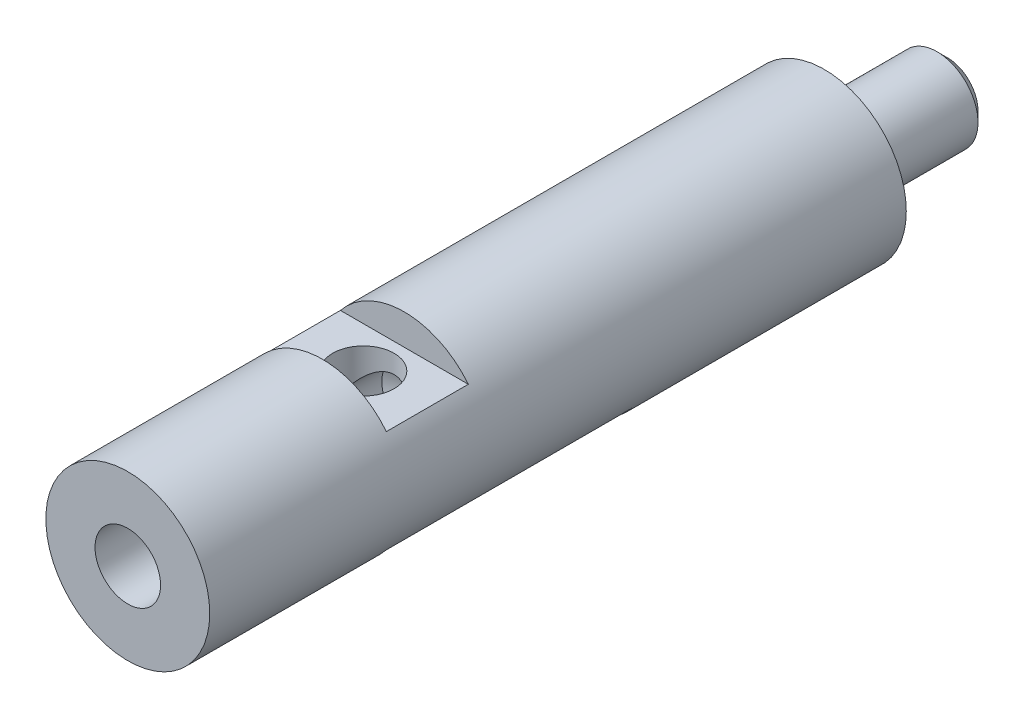
ISO-10303-21;
HEADER;
FILE_DESCRIPTION(('STEP AP214'),'2;1');
FILE_NAME('part.step','',(''),(''),'','','');
FILE_SCHEMA(('AUTOMOTIVE_DESIGN { 1 0 10303 214 1 1 1 1 }'));
ENDSEC;
DATA;
#1=APPLICATION_CONTEXT('core data for automotive mechanical design processes');
#2=APPLICATION_PROTOCOL_DEFINITION('international standard','automotive_design',2000,#1);
#3=PRODUCT_CONTEXT('',#1,'mechanical');
#4=PRODUCT('Part','Part','',(#3));
#5=PRODUCT_RELATED_PRODUCT_CATEGORY('part','',(#4));
#6=PRODUCT_DEFINITION_FORMATION('','',#4);
#7=PRODUCT_DEFINITION_CONTEXT('part definition',#1,'design');
#8=PRODUCT_DEFINITION('design','',#6,#7);
#9=PRODUCT_DEFINITION_SHAPE('','',#8);
#10=(LENGTH_UNIT() NAMED_UNIT(*) SI_UNIT(.MILLI.,.METRE.));
#11=(NAMED_UNIT(*) PLANE_ANGLE_UNIT() SI_UNIT($,.RADIAN.));
#12=(NAMED_UNIT(*) SI_UNIT($,.STERADIAN.) SOLID_ANGLE_UNIT());
#13=UNCERTAINTY_MEASURE_WITH_UNIT(LENGTH_MEASURE(1.E-05),#10,'distance_accuracy_value','');
#14=(GEOMETRIC_REPRESENTATION_CONTEXT(3) GLOBAL_UNCERTAINTY_ASSIGNED_CONTEXT((#13)) GLOBAL_UNIT_ASSIGNED_CONTEXT((#10,
#11,#12)) REPRESENTATION_CONTEXT('',''));
#15=CARTESIAN_POINT('',(0.,0.,0.));
#16=DIRECTION('',(0.,0.,1.));
#17=DIRECTION('',(1.,0.,0.));
#18=AXIS2_PLACEMENT_3D('',#15,#16,#17);
#19=CARTESIAN_POINT('',(-6.00000133751827,3.70264042682365,-4.81401753038767));
#20=DIRECTION('',(0.,-1.,0.));
#21=DIRECTION('',(0.,0.,-1.));
#22=AXIS2_PLACEMENT_3D('',#19,#20,#21);
#23=PLANE('',#22);
#24=DIRECTION('',(0.,0.,1.));
#25=VECTOR('',#24,1.);
#26=CARTESIAN_POINT('',(4.68374716128053,3.70264042682365,-41.5640175303877));
#27=LINE('',#26,#25);
#28=CARTESIAN_POINT('',(4.68374716128053,3.70264042682365,-4.81401753038767));
#29=VERTEX_POINT('',#28);
#30=CARTESIAN_POINT('',(4.68374716128053,3.70264042682365,-10.8140175303877));
#31=VERTEX_POINT('',#30);
#32=EDGE_CURVE('E83',#29,#31,#27,.F.);
#33=ORIENTED_EDGE('',*,*,#32,.T.);
#34=DIRECTION('',(1.,0.,0.));
#35=VECTOR('',#34,1.);
#36=CARTESIAN_POINT('',(-6.00000133751827,3.70264042682365,-10.8140175303877));
#37=LINE('',#36,#35);
#38=CARTESIAN_POINT('',(-4.68374983631707,3.70264042682365,-10.8140175303877));
#39=VERTEX_POINT('',#38);
#40=EDGE_CURVE('E52',#39,#31,#37,.T.);
#41=ORIENTED_EDGE('',*,*,#40,.F.);
#42=DIRECTION('',(0.,0.,1.));
#43=VECTOR('',#42,1.);
#44=CARTESIAN_POINT('',(-4.68374983631707,3.70264042682365,-41.5640175303877));
#45=LINE('',#44,#43);
#46=CARTESIAN_POINT('',(-4.68374983631707,3.70264042682365,-4.81401753038767));
#47=VERTEX_POINT('',#46);
#48=EDGE_CURVE('E84',#39,#47,#45,.T.);
#49=ORIENTED_EDGE('',*,*,#48,.T.);
#50=DIRECTION('',(1.,0.,0.));
#51=VECTOR('',#50,1.);
#52=CARTESIAN_POINT('',(-6.00000133751827,3.70264042682365,-4.81401753038767));
#53=LINE('',#52,#51);
#54=EDGE_CURVE('E91',#47,#29,#53,.T.);
#55=ORIENTED_EDGE('',*,*,#54,.T.);
#56=EDGE_LOOP('',(#33,#41,#49,#55));
#57=FACE_BOUND('',#56,.T.);
#58=CARTESIAN_POINT('',(-1.33751827095262E-06,3.70264042682365,-7.81401753038767));
#59=DIRECTION('',(0.,1.,0.));
#60=DIRECTION('',(0.,0.,1.));
#61=AXIS2_PLACEMENT_3D('',#58,#59,#60);
#62=CIRCLE('',#61,2.24999999999998);
#63=CARTESIAN_POINT('',(-1.33751827095262E-06,3.70264042682365,-5.56401753038769));
#64=VERTEX_POINT('',#63);
#65=EDGE_CURVE('E293',#64,#64,#62,.T.);
#66=ORIENTED_EDGE('',*,*,#65,.F.);
#67=EDGE_LOOP('',(#66));
#68=FACE_BOUND('',#67,.T.);
#69=ADVANCED_FACE('F37',(#57,#68),#23,.F.);
#70=CARTESIAN_POINT('',(-1.33751827062736E-06,-0.0473595731763541,-41.5640175303877));
#71=DIRECTION('',(0.,0.,1.));
#72=DIRECTION('',(1.,0.,0.));
#73=AXIS2_PLACEMENT_3D('',#70,#71,#72);
#74=CYLINDRICAL_SURFACE('',#73,6.);
#75=CARTESIAN_POINT('',(-1.33751827062736E-06,-0.0473595731763541,-22.8140175303877));
#76=DIRECTION('',(0.,0.,-1.));
#77=DIRECTION('',(-1.,0.,0.));
#78=AXIS2_PLACEMENT_3D('',#75,#76,#77);
#79=CIRCLE('',#78,6.);
#80=CARTESIAN_POINT('',(-4.68374983631707,-3.79735957317635,-22.8140175303877));
#81=VERTEX_POINT('',#80);
#82=CARTESIAN_POINT('',(4.68374716128053,-3.79735957317635,-22.8140175303877));
#83=VERTEX_POINT('',#82);
#84=EDGE_CURVE('E92',#81,#83,#79,.F.);
#85=ORIENTED_EDGE('',*,*,#84,.F.);
#86=DIRECTION('',(0.,0.,1.));
#87=VECTOR('',#86,1.);
#88=CARTESIAN_POINT('',(-4.68374983631707,-3.79735957317635,-41.5640175303877));
#89=LINE('',#88,#87);
#90=CARTESIAN_POINT('',(-4.68374983631707,-3.79735957317635,-4.81401753038767));
#91=VERTEX_POINT('',#90);
#92=EDGE_CURVE('E11',#91,#81,#89,.F.);
#93=ORIENTED_EDGE('',*,*,#92,.F.);
#94=CARTESIAN_POINT('',(-1.33751827062736E-06,-0.0473595731763541,-4.81401753038767));
#95=DIRECTION('',(0.,0.,1.));
#96=DIRECTION('',(1.,0.,0.));
#97=AXIS2_PLACEMENT_3D('',#94,#95,#96);
#98=CIRCLE('',#97,6.);
#99=CARTESIAN_POINT('',(4.68374716128053,-3.79735957317635,-4.81401753038767));
#100=VERTEX_POINT('',#99);
#101=EDGE_CURVE('E45',#100,#91,#98,.F.);
#102=ORIENTED_EDGE('',*,*,#101,.F.);
#103=DIRECTION('',(0.,0.,1.));
#104=VECTOR('',#103,1.);
#105=CARTESIAN_POINT('',(4.68374716128053,-3.79735957317635,-41.5640175303877));
#106=LINE('',#105,#104);
#107=EDGE_CURVE('E128',#83,#100,#106,.T.);
#108=ORIENTED_EDGE('',*,*,#107,.F.);
#109=EDGE_LOOP('',(#85,#93,#102,#108));
#110=FACE_BOUND('',#109,.T.);
#111=ORIENTED_EDGE('',*,*,#32,.F.);
#112=CARTESIAN_POINT('',(-1.33751827062736E-06,-0.0473595731763541,-4.81401753038766));
#113=DIRECTION('',(0.,0.,1.));
#114=DIRECTION('',(0.,-1.,0.));
#115=AXIS2_PLACEMENT_3D('',#112,#113,#114);
#116=CIRCLE('',#115,6.);
#117=EDGE_CURVE('E86',#47,#29,#116,.F.);
#118=ORIENTED_EDGE('',*,*,#117,.F.);
#119=ORIENTED_EDGE('',*,*,#48,.F.);
#120=CARTESIAN_POINT('',(-1.33751827062736E-06,-0.0473595731763541,-10.8140175303877));
#121=DIRECTION('',(0.,0.,-1.));
#122=DIRECTION('',(-1.,0.,0.));
#123=AXIS2_PLACEMENT_3D('',#120,#121,#122);
#124=CIRCLE('',#123,6.);
#125=EDGE_CURVE('E79',#31,#39,#124,.F.);
#126=ORIENTED_EDGE('',*,*,#125,.F.);
#127=EDGE_LOOP('',(#111,#118,#119,#126));
#128=FACE_BOUND('',#127,.T.);
#129=CARTESIAN_POINT('',(-1.33751827062736E-06,-0.0473595731763541,-41.5640175303877));
#130=DIRECTION('',(0.,0.,1.));
#131=DIRECTION('',(1.,0.,0.));
#132=AXIS2_PLACEMENT_3D('',#129,#130,#131);
#133=CIRCLE('',#132,6.);
#134=CARTESIAN_POINT('',(5.99999866248173,-0.0473595731763541,-41.5640175303877));
#135=VERTEX_POINT('',#134);
#136=EDGE_CURVE('E115',#135,#135,#133,.T.);
#137=ORIENTED_EDGE('',*,*,#136,.T.);
#138=EDGE_LOOP('',(#137));
#139=FACE_BOUND('',#138,.T.);
#140=CARTESIAN_POINT('',(-1.33751827062736E-06,-0.0473595731763541,9.43598246961233));
#141=DIRECTION('',(0.,0.,1.));
#142=DIRECTION('',(1.,0.,0.));
#143=AXIS2_PLACEMENT_3D('',#140,#141,#142);
#144=CIRCLE('',#143,6.);
#145=CARTESIAN_POINT('',(5.99999866248173,-0.0473595731763541,9.43598246961233));
#146=VERTEX_POINT('',#145);
#147=EDGE_CURVE('E110',#146,#146,#144,.T.);
#148=ORIENTED_EDGE('',*,*,#147,.F.);
#149=EDGE_LOOP('',(#148));
#150=FACE_BOUND('',#149,.T.);
#151=ADVANCED_FACE('F80',(#110,#128,#139,#150),#74,.T.);
#152=CARTESIAN_POINT('',(-1.33751827062736E-06,-0.0473595731763541,-41.5640175303877));
#153=DIRECTION('',(0.,0.,1.));
#154=DIRECTION('',(1.,0.,0.));
#155=AXIS2_PLACEMENT_3D('',#152,#153,#154);
#156=PLANE('',#155);
#157=CARTESIAN_POINT('',(-1.33751827062736E-06,-0.0473595731763541,-41.5640175303877));
#158=DIRECTION('',(0.,0.,-1.));
#159=DIRECTION('',(-1.,0.,0.));
#160=AXIS2_PLACEMENT_3D('',#157,#158,#159);
#161=CIRCLE('',#160,3.);
#162=CARTESIAN_POINT('',(-3.00000133751827,-0.0473595731763541,-41.5640175303877));
#163=VERTEX_POINT('',#162);
#164=EDGE_CURVE('E111',#163,#163,#161,.T.);
#165=ORIENTED_EDGE('',*,*,#164,.F.);
#166=EDGE_LOOP('',(#165));
#167=FACE_BOUND('',#166,.T.);
#168=ORIENTED_EDGE('',*,*,#136,.F.);
#169=EDGE_LOOP('',(#168));
#170=FACE_BOUND('',#169,.T.);
#171=ADVANCED_FACE('F158',(#167,#170),#156,.F.);
#172=CARTESIAN_POINT('',(-1.33751827062736E-06,-0.0473595731763541,9.43598246961233));
#173=DIRECTION('',(0.,0.,1.));
#174=DIRECTION('',(1.,0.,0.));
#175=AXIS2_PLACEMENT_3D('',#172,#173,#174);
#176=PLANE('',#175);
#177=CARTESIAN_POINT('',(-1.33751827062736E-06,-0.0473595731763541,9.43598246961233));
#178=DIRECTION('',(0.,0.,1.));
#179=DIRECTION('',(1.,0.,0.));
#180=AXIS2_PLACEMENT_3D('',#177,#178,#179);
#181=CIRCLE('',#180,2.39999999999998);
#182=CARTESIAN_POINT('',(2.39999866248171,-0.0473595731763541,9.43598246961233));
#183=VERTEX_POINT('',#182);
#184=EDGE_CURVE('E104',#183,#183,#181,.T.);
#185=ORIENTED_EDGE('',*,*,#184,.F.);
#186=EDGE_LOOP('',(#185));
#187=FACE_BOUND('',#186,.T.);
#188=ORIENTED_EDGE('',*,*,#147,.T.);
#189=EDGE_LOOP('',(#188));
#190=FACE_BOUND('',#189,.T.);
#191=ADVANCED_FACE('F179',(#187,#190),#176,.T.);
#192=CARTESIAN_POINT('',(-1.33751827062736E-06,-0.0473595731763541,-50.5640175303877));
#193=DIRECTION('',(0.,0.,1.));
#194=DIRECTION('',(1.,0.,0.));
#195=AXIS2_PLACEMENT_3D('',#192,#193,#194);
#196=CYLINDRICAL_SURFACE('',#195,3.);
#197=CARTESIAN_POINT('',(-1.33751827062736E-06,-0.0473595731763541,-49.8140175303877));
#198=DIRECTION('',(0.,0.,-1.));
#199=DIRECTION('',(-1.,0.,0.));
#200=AXIS2_PLACEMENT_3D('',#197,#198,#199);
#201=CIRCLE('',#200,3.);
#202=CARTESIAN_POINT('',(-3.00000133751827,-0.0473595731763541,-49.8140175303877));
#203=VERTEX_POINT('',#202);
#204=EDGE_CURVE('E122',#203,#203,#201,.F.);
#205=ORIENTED_EDGE('',*,*,#204,.T.);
#206=EDGE_LOOP('',(#205));
#207=FACE_BOUND('',#206,.T.);
#208=ORIENTED_EDGE('',*,*,#164,.T.);
#209=EDGE_LOOP('',(#208));
#210=FACE_BOUND('',#209,.T.);
#211=ADVANCED_FACE('F175',(#207,#210),#196,.T.);
#212=CARTESIAN_POINT('',(-1.33751827062736E-06,-0.0473595731763541,-50.5640175303877));
#213=DIRECTION('',(0.,0.,-1.));
#214=DIRECTION('',(-1.,0.,0.));
#215=AXIS2_PLACEMENT_3D('',#212,#213,#214);
#216=PLANE('',#215);
#217=CARTESIAN_POINT('',(-1.33751827062736E-06,-0.0473595731763541,-50.5640175303877));
#218=DIRECTION('',(0.,0.,-1.));
#219=DIRECTION('',(-1.,0.,0.));
#220=AXIS2_PLACEMENT_3D('',#217,#218,#219);
#221=CIRCLE('',#220,2.24999999999999);
#222=CARTESIAN_POINT('',(-2.25000133751826,-0.0473595731763541,-50.5640175303877));
#223=VERTEX_POINT('',#222);
#224=EDGE_CURVE('E114',#223,#223,#221,.T.);
#225=ORIENTED_EDGE('',*,*,#224,.T.);
#226=EDGE_LOOP('',(#225));
#227=FACE_BOUND('',#226,.T.);
#228=ADVANCED_FACE('F172',(#227),#216,.T.);
#229=CARTESIAN_POINT('',(-1.33751827062736E-06,-0.0473595731763541,-50.5640175303877));
#230=DIRECTION('',(0.,0.,1.));
#231=DIRECTION('',(1.,0.,0.));
#232=AXIS2_PLACEMENT_3D('',#229,#230,#231);
#233=CONICAL_SURFACE('',#232,2.24999999999999,0.785398163397454);
#234=ORIENTED_EDGE('',*,*,#204,.F.);
#235=EDGE_LOOP('',(#234));
#236=FACE_BOUND('',#235,.T.);
#237=ORIENTED_EDGE('',*,*,#224,.F.);
#238=EDGE_LOOP('',(#237));
#239=FACE_BOUND('',#238,.T.);
#240=ADVANCED_FACE('F39',(#236,#239),#233,.T.);
#241=CARTESIAN_POINT('',(-1.33751827062736E-06,-0.0473595731763541,-11.5640175303877));
#242=DIRECTION('',(0.,0.,1.));
#243=DIRECTION('',(1.,0.,0.));
#244=AXIS2_PLACEMENT_3D('',#241,#242,#243);
#245=CONICAL_SURFACE('',#244,2.4,1.02974425867665);
#246=CARTESIAN_POINT('',(-1.33751827612408E-06,-0.0473595731763541,-13.0060830160538));
#247=VERTEX_POINT('',#246);
#248=VERTEX_LOOP('',#247);
#249=FACE_BOUND('',#248,.T.);
#250=CARTESIAN_POINT('',(-1.33751827062736E-06,-0.0473595731763541,-11.5640175303877));
#251=DIRECTION('',(0.,0.,1.));
#252=DIRECTION('',(1.,0.,0.));
#253=AXIS2_PLACEMENT_3D('',#250,#251,#252);
#254=CIRCLE('',#253,2.4);
#255=CARTESIAN_POINT('',(2.39999866248172,-0.0473595731763541,-11.5640175303877));
#256=VERTEX_POINT('',#255);
#257=EDGE_CURVE('E107',#256,#256,#254,.T.);
#258=ORIENTED_EDGE('',*,*,#257,.T.);
#259=EDGE_LOOP('',(#258));
#260=FACE_BOUND('',#259,.T.);
#261=ADVANCED_FACE('F168',(#249,#260),#245,.F.);
#262=CARTESIAN_POINT('',(-1.33751827062736E-06,-0.0473595731763541,9.43598246961233));
#263=DIRECTION('',(0.,0.,1.));
#264=DIRECTION('',(1.,0.,0.));
#265=AXIS2_PLACEMENT_3D('',#262,#263,#264);
#266=CYLINDRICAL_SURFACE('',#265,2.39999999999999);
#267=CARTESIAN_POINT('',(-1.33751827095262E-06,2.35264042682364,-5.56401753038768));
#268=CARTESIAN_POINT('',(0.102637025547142,2.3526269335436,-5.56403118206114));
#269=CARTESIAN_POINT('',(0.205453301947714,2.34598744194699,-5.57110982801168));
#270=CARTESIAN_POINT('',(0.407729961308926,2.31996598780267,-5.59889838593913));
#271=CARTESIAN_POINT('',(0.507179460319837,2.30054620661465,-5.61964875464111));
#272=CARTESIAN_POINT('',(0.699042220443843,2.25070314676065,-5.67306356106733));
#273=CARTESIAN_POINT('',(0.791500637578504,2.22035939732682,-5.70564190236786));
#274=CARTESIAN_POINT('',(0.968434748923246,2.15063730210877,-5.78082123336326));
#275=CARTESIAN_POINT('',(1.05291263636959,2.11126144881576,-5.82341945806255));
#276=CARTESIAN_POINT('',(1.24573142753312,2.00799367799864,-5.93581237148869));
#277=CARTESIAN_POINT('',(1.34986269043738,1.94063430951448,-6.00963155097316));
#278=CARTESIAN_POINT('',(1.54094947608372,1.79651160636658,-6.16975304461768));
#279=CARTESIAN_POINT('',(1.62784507449578,1.7197169153307,-6.25609716446851));
#280=CARTESIAN_POINT('',(1.75614826779859,1.59000567786781,-6.40537316699182));
#281=CARTESIAN_POINT('',(1.80259522168247,1.53858139996538,-6.46537586357371));
#282=CARTESIAN_POINT('',(1.88892689850003,1.43470282411142,-6.5892092371923));
#283=CARTESIAN_POINT('',(1.9288067492546,1.38224779344387,-6.65304270882919));
#284=CARTESIAN_POINT('',(2.00200386444243,1.27779383337124,-6.78439724903665));
#285=CARTESIAN_POINT('',(2.03533721939516,1.2257940935942,-6.85190874164379));
#286=CARTESIAN_POINT('',(2.09555300229602,1.12401615066704,-6.99126670235326));
#287=CARTESIAN_POINT('',(2.12244392828745,1.0742350922974,-7.06310730164211));
#288=CARTESIAN_POINT('',(2.16237599483045,0.994501575765726,-7.18984095999935));
#289=CARTESIAN_POINT('',(2.17714487743155,0.963111037001207,-7.24327444614831));
#290=CARTESIAN_POINT('',(2.20310947822572,0.90516456005369,-7.35357278085786));
#291=CARTESIAN_POINT('',(2.21430913163576,0.878603311366065,-7.4104337676034));
#292=CARTESIAN_POINT('',(2.23065144172954,0.838395946710746,-7.51584776581769));
#293=CARTESIAN_POINT('',(2.23656908661398,0.823213063781211,-7.56367236390807));
#294=CARTESIAN_POINT('',(2.24534099158594,0.800339605524335,-7.66130170722465));
#295=CARTESIAN_POINT('',(2.24820489826175,0.792625444070687,-7.71109969847894));
#296=CARTESIAN_POINT('',(2.25056394288577,0.786290653245336,-7.81179312726139));
#297=CARTESIAN_POINT('',(2.25003215865412,0.787742695585448,-7.86269413849379));
#298=CARTESIAN_POINT('',(2.24560730902656,0.79956125345617,-7.96333533918064));
#299=CARTESIAN_POINT('',(2.24170649869534,0.809948309152958,-8.01307258249937));
#300=CARTESIAN_POINT('',(2.22875670763985,0.843177478334406,-8.13007727782644));
#301=CARTESIAN_POINT('',(2.21825362954289,0.869378229972031,-8.19618231197103));
#302=CARTESIAN_POINT('',(2.19245113054261,0.929486516077802,-8.32385059667237));
#303=CARTESIAN_POINT('',(2.1771305363201,0.963427886610554,-8.38539228624714));
#304=CARTESIAN_POINT('',(2.14058340682022,1.03883620201841,-8.51045873416996));
#305=CARTESIAN_POINT('',(2.11893087547557,1.08071287318017,-8.57360596747389));
#306=CARTESIAN_POINT('',(2.07080274693951,1.16681258298087,-8.69641257544873));
#307=CARTESIAN_POINT('',(2.04432228927244,1.21103795406434,-8.75606835444241));
#308=CARTESIAN_POINT('',(1.98656431311886,1.30037636577543,-8.87244955542655));
#309=CARTESIAN_POINT('',(1.95528069378338,1.34549047081568,-8.92917112621445));
#310=CARTESIAN_POINT('',(1.88788946547442,1.43555507659442,-9.03980873748977));
#311=CARTESIAN_POINT('',(1.85178158382476,1.48050556793754,-9.09372461915496));
#312=CARTESIAN_POINT('',(1.77076502471818,1.57392921778439,-9.20398797908941));
#313=CARTESIAN_POINT('',(1.72533752789595,1.62230576388297,-9.26004041430262));
#314=CARTESIAN_POINT('',(1.6283681260014,1.71701650721174,-9.36843468952271));
#315=CARTESIAN_POINT('',(1.57682422420918,1.76335003068273,-9.42077530883744));
#316=CARTESIAN_POINT('',(1.41303830644068,1.89766863080793,-9.57119976161595));
#317=CARTESIAN_POINT('',(1.29123860939152,1.9814587631329,-9.66324895955191));
#318=CARTESIAN_POINT('',(1.0733051859229,2.10140426969589,-9.79393242950108));
#319=CARTESIAN_POINT('',(0.984692732009298,2.14363553557818,-9.83964861139628));
#320=CARTESIAN_POINT('',(0.798571853652061,2.21809658801059,-9.91996700810299));
#321=CARTESIAN_POINT('',(0.701069342730192,2.25033296109341,-9.95457654261136));
#322=CARTESIAN_POINT('',(0.498235898882152,2.30270660988897,-10.010699701688));
#323=CARTESIAN_POINT('',(0.392846097664549,2.32274000038534,-10.0321009021519));
#324=CARTESIAN_POINT('',(0.178374295387754,2.34843051458638,-10.0595318399412));
#325=CARTESIAN_POINT('',(0.069295331335085,2.35409918516786,-10.0655739234876));
#326=CARTESIAN_POINT('',(-0.134737644879984,2.35075385855576,-10.0620048483968));
#327=CARTESIAN_POINT('',(-0.229762219087661,2.34347717590905,-10.0542458668889));
#328=CARTESIAN_POINT('',(-0.416631853226356,2.31808144110337,-10.027122570357));
#329=CARTESIAN_POINT('',(-0.508476504494589,2.29996100080698,-10.0077567695135));
#330=CARTESIAN_POINT('',(-0.686605320382889,2.25416764695226,-9.95868650320969));
#331=CARTESIAN_POINT('',(-0.772899265811087,2.2265121144161,-9.92900084846227));
#332=CARTESIAN_POINT('',(-0.93874081892531,2.16321936160749,-9.86080035023966));
#333=CARTESIAN_POINT('',(-1.0182866426878,2.12758003976149,-9.82228318198145));
#334=CARTESIAN_POINT('',(-1.20648683616448,2.03117848780204,-9.71754672850619));
#335=CARTESIAN_POINT('',(-1.31072606040905,1.96658011538114,-9.64691657332296));
#336=CARTESIAN_POINT('',(-1.50264828856924,1.82778034071578,-9.49323185323937));
#337=CARTESIAN_POINT('',(-1.5902742420198,1.75354727156547,-9.41013617025799));
#338=CARTESIAN_POINT('',(-1.72119779964991,1.62674254692542,-9.26517988632303));
#339=CARTESIAN_POINT('',(-1.76924413654266,1.57573968705882,-9.20613535647114));
#340=CARTESIAN_POINT('',(-1.85873248991502,1.47243871565478,-9.08419289176122));
#341=CARTESIAN_POINT('',(-1.90017008021445,1.42013976292601,-9.02129241310702));
#342=CARTESIAN_POINT('',(-1.97646421667608,1.31564056852614,-8.89185255409197));
#343=CARTESIAN_POINT('',(-2.01133591935263,1.26344038186846,-8.82532202318286));
#344=CARTESIAN_POINT('',(-2.07465125064887,1.1607153700337,-8.68811238215432));
#345=CARTESIAN_POINT('',(-2.10310189852357,1.11018876743867,-8.6174379095962));
#346=CARTESIAN_POINT('',(-2.14620498648362,1.02750117179636,-8.49178263056031));
#347=CARTESIAN_POINT('',(-2.16247611289437,0.994222409315969,-8.43809883245293));
#348=CARTESIAN_POINT('',(-2.19141393334653,0.931866392165179,-8.32733007302669));
#349=CARTESIAN_POINT('',(-2.20408128516747,0.902788371231289,-8.27024573469535));
#350=CARTESIAN_POINT('',(-2.22339243210495,0.856547952795997,-8.16253550293675));
#351=CARTESIAN_POINT('',(-2.23070651370937,0.838186456955201,-8.11256361443239));
#352=CARTESIAN_POINT('',(-2.24202429312288,0.809134296545712,-8.01014626855979));
#353=CARTESIAN_POINT('',(-2.24604039362255,0.798414912598878,-7.95771086999756));
#354=CARTESIAN_POINT('',(-2.25033965619138,0.786922722911264,-7.85085275305021));
#355=CARTESIAN_POINT('',(-2.25057559150395,0.786275757788371,-7.7964133972394));
#356=CARTESIAN_POINT('',(-2.24715105763172,0.795453430056984,-7.68851638625931));
#357=CARTESIAN_POINT('',(-2.2434823099344,0.805300316041842,-7.63506106228077));
#358=CARTESIAN_POINT('',(-2.23124817739775,0.836880076052012,-7.51650215676208));
#359=CARTESIAN_POINT('',(-2.22161632564329,0.861130947962101,-7.45222152984113));
#360=CARTESIAN_POINT('',(-2.19779056167293,0.917346751661695,-7.32795350473596));
#361=CARTESIAN_POINT('',(-2.18357646971127,0.94934564689011,-7.2679865596892));
#362=CARTESIAN_POINT('',(-2.14963469818609,1.02071540189701,-7.14623837027227));
#363=CARTESIAN_POINT('',(-2.12951535456513,1.06049599524879,-7.08481307603419));
#364=CARTESIAN_POINT('',(-2.08477608898149,1.142559911402,-6.96532142606475));
#365=CARTESIAN_POINT('',(-2.06015153029036,1.18484578201337,-6.90725861277752));
#366=CARTESIAN_POINT('',(-2.00645514783349,1.2704805400576,-6.79393138960541));
#367=CARTESIAN_POINT('',(-1.97737810841232,1.31383062344767,-6.73867036413443));
#368=CARTESIAN_POINT('',(-1.91476733479129,1.40058260171145,-6.63077560677064));
#369=CARTESIAN_POINT('',(-1.88123323746801,1.44398450052082,-6.57814208942613));
#370=CARTESIAN_POINT('',(-1.80541164222903,1.53517202225685,-6.46944294516191));
#371=CARTESIAN_POINT('',(-1.76255885010616,1.58287516104081,-6.41369818679982));
#372=CARTESIAN_POINT('',(-1.67104393008661,1.6765658450108,-6.30566186235862));
#373=CARTESIAN_POINT('',(-1.62237999981847,1.72255285208982,-6.25337137550109));
#374=CARTESIAN_POINT('',(-1.46764890826927,1.85645783417685,-6.102532092357));
#375=CARTESIAN_POINT('',(-1.352511790323,1.94073527761841,-6.00953112884752));
#376=CARTESIAN_POINT('',(-1.14226615636989,2.06560365016989,-5.87299527419076));
#377=CARTESIAN_POINT('',(-1.05398287855385,2.11122776364117,-5.82347169505406));
#378=CARTESIAN_POINT('',(-0.86771973307852,2.19258346000725,-5.73552546873179));
#379=CARTESIAN_POINT('',(-0.769746465219199,2.2283217139724,-5.6970953348194));
#380=CARTESIAN_POINT('',(-0.579301370525196,2.28350498091316,-5.63789098137805));
#381=CARTESIAN_POINT('',(-0.487784823107426,2.30446926069437,-5.61546535502431));
#382=CARTESIAN_POINT('',(-0.301007125847794,2.3355567602426,-5.58224107362023));
#383=CARTESIAN_POINT('',(-0.205757093380304,2.3457099563962,-5.57141026862495));
#384=CARTESIAN_POINT('',(-0.0734378948202123,2.35180155654719,-5.56491250526959));
#385=CARTESIAN_POINT('',(-0.0367310079897954,2.35264525546387,-5.56401264506554));
#386=CARTESIAN_POINT('',(-1.33751827095262E-06,2.35264042682364,-5.56401753038768));
#387=B_SPLINE_CURVE_WITH_KNOTS('',3,(#267,#268,#269,#270,#271,#272,#273,#274,#275,#276,#277,
#278,#279,#280,#281,#282,#283,#284,#285,#286,#287,#288,#289,#290,#291,#292,#293,#294,#295,#296,
#297,#298,#299,#300,#301,#302,#303,#304,#305,#306,#307,#308,#309,#310,#311,#312,#313,#314,#315,
#316,#317,#318,#319,#320,#321,#322,#323,#324,#325,#326,#327,#328,#329,#330,#331,#332,#333,#334,
#335,#336,#337,#338,#339,#340,#341,#342,#343,#344,#345,#346,#347,#348,#349,#350,#351,#352,#353,
#354,#355,#356,#357,#358,#359,#360,#361,#362,#363,#364,#365,#366,#367,#368,#369,#370,#371,#372,
#373,#374,#375,#376,#377,#378,#379,#380,#381,#382,#383,#384,#385,#386),.UNSPECIFIED.,.T.,.F.,(4,
2,2,2,2,2,2,2,2,2,2,2,2,2,2,2,2,2,2,2,2,2,2,2,2,2,2,2,2,2,2,2,2,2,2,2,2,2,2,2,2,2,2,2,2,2,2,2,2,
2,2,2,2,2,2,2,2,2,2,4),(0.,0.307786791525601,0.616488486808624,0.922986756713319,
1.22940054717278,1.66003337449567,2.09213813162533,2.36683644406865,2.64173764773794,
2.91595447965175,3.18980758267394,3.38069283686219,3.57136689847501,3.72242504439951,
3.87300457940609,4.02477943388805,4.17690412975399,4.39132774026614,4.60670724934893,
4.84277920512611,5.07909015010662,5.31570377280408,5.55233077500027,5.81259336798516,
6.07294115948156,6.5911293668751,6.91485562301866,7.23836809118868,7.56459750616098,
7.89056460293057,8.17601785297967,8.46150765245586,8.74647977501924,9.03152699914786,
9.45375738131081,9.8774124453844,10.1519985567756,10.4267678057046,10.7008947929232,
10.9747206475288,11.1701824258116,11.3656085044797,11.5263200640057,11.6864244327186,
11.8485274960429,12.0109749280378,12.2179455226962,12.4258403413331,12.6532029603321,
12.8808009089329,13.1086675356326,13.3365527383726,13.5911498284821,13.8458260900446,
14.3530476499843,14.6850141618923,15.0167561101598,15.3051279980645,15.5926982051276,
15.7028413045554),.UNSPECIFIED.);
#388=CARTESIAN_POINT('',(-1.33751827095262E-06,2.35264042682364,-5.56401753038768));
#389=VERTEX_POINT('',#388);
#390=EDGE_CURVE('E100',#389,#389,#387,.T.);
#391=ORIENTED_EDGE('',*,*,#390,.T.);
#392=EDGE_LOOP('',(#391));
#393=FACE_BOUND('',#392,.T.);
#394=ORIENTED_EDGE('',*,*,#257,.F.);
#395=EDGE_LOOP('',(#394));
#396=FACE_BOUND('',#395,.T.);
#397=ORIENTED_EDGE('',*,*,#184,.T.);
#398=EDGE_LOOP('',(#397));
#399=FACE_BOUND('',#398,.T.);
#400=ADVANCED_FACE('F164',(#393,#396,#399),#266,.F.);
#401=CARTESIAN_POINT('',(-6.00000133751827,5.95264042682365,-4.81401753038767));
#402=DIRECTION('',(0.,0.,1.));
#403=DIRECTION('',(0.,-1.,0.));
#404=AXIS2_PLACEMENT_3D('',#401,#402,#403);
#405=PLANE('',#404);
#406=ORIENTED_EDGE('',*,*,#117,.T.);
#407=ORIENTED_EDGE('',*,*,#54,.F.);
#408=EDGE_LOOP('',(#406,#407));
#409=FACE_BOUND('',#408,.T.);
#410=ADVANCED_FACE('F161',(#409),#405,.F.);
#411=CARTESIAN_POINT('',(-6.00000133751827,5.95264042682365,-10.8140175303877));
#412=DIRECTION('',(0.,0.,-1.));
#413=DIRECTION('',(-1.,0.,0.));
#414=AXIS2_PLACEMENT_3D('',#411,#412,#413);
#415=PLANE('',#414);
#416=ORIENTED_EDGE('',*,*,#40,.T.);
#417=ORIENTED_EDGE('',*,*,#125,.T.);
#418=EDGE_LOOP('',(#416,#417));
#419=FACE_BOUND('',#418,.T.);
#420=ADVANCED_FACE('F94',(#419),#415,.F.);
#421=CARTESIAN_POINT('',(-6.00000133751827,-3.79735957317635,-4.81401753038767));
#422=DIRECTION('',(0.,0.,1.));
#423=DIRECTION('',(1.,0.,0.));
#424=AXIS2_PLACEMENT_3D('',#421,#422,#423);
#425=PLANE('',#424);
#426=DIRECTION('',(1.,0.,0.));
#427=VECTOR('',#426,1.);
#428=CARTESIAN_POINT('',(-6.00000133751827,-3.79735957317635,-4.81401753038767));
#429=LINE('',#428,#427);
#430=EDGE_CURVE('E98',#91,#100,#429,.T.);
#431=ORIENTED_EDGE('',*,*,#430,.T.);
#432=ORIENTED_EDGE('',*,*,#101,.T.);
#433=EDGE_LOOP('',(#431,#432));
#434=FACE_BOUND('',#433,.T.);
#435=ADVANCED_FACE('F133',(#434),#425,.F.);
#436=CARTESIAN_POINT('',(-6.00000133751827,-3.79735957317635,-4.81401753038767));
#437=DIRECTION('',(0.,1.,0.));
#438=DIRECTION('',(0.,0.,1.));
#439=AXIS2_PLACEMENT_3D('',#436,#437,#438);
#440=PLANE('',#439);
#441=ORIENTED_EDGE('',*,*,#92,.T.);
#442=DIRECTION('',(1.,0.,0.));
#443=VECTOR('',#442,1.);
#444=CARTESIAN_POINT('',(-6.00000133751827,-3.79735957317635,-22.8140175303877));
#445=LINE('',#444,#443);
#446=EDGE_CURVE('E95',#81,#83,#445,.T.);
#447=ORIENTED_EDGE('',*,*,#446,.T.);
#448=ORIENTED_EDGE('',*,*,#107,.T.);
#449=ORIENTED_EDGE('',*,*,#430,.F.);
#450=EDGE_LOOP('',(#441,#447,#448,#449));
#451=FACE_BOUND('',#450,.T.);
#452=ADVANCED_FACE('F138',(#451),#440,.F.);
#453=CARTESIAN_POINT('',(-6.00000133751827,-3.79735957317635,-22.8140175303877));
#454=DIRECTION('',(0.,0.,-1.));
#455=DIRECTION('',(-1.,0.,0.));
#456=AXIS2_PLACEMENT_3D('',#453,#454,#455);
#457=PLANE('',#456);
#458=ORIENTED_EDGE('',*,*,#446,.F.);
#459=ORIENTED_EDGE('',*,*,#84,.T.);
#460=EDGE_LOOP('',(#458,#459));
#461=FACE_BOUND('',#460,.T.);
#462=ADVANCED_FACE('F141',(#461),#457,.F.);
#463=CARTESIAN_POINT('',(-1.33751827095262E-06,3.70264042682365,-7.81401753038767));
#464=DIRECTION('',(0.,1.,0.));
#465=DIRECTION('',(0.,0.,1.));
#466=AXIS2_PLACEMENT_3D('',#463,#464,#465);
#467=CYLINDRICAL_SURFACE('',#466,2.24999999999999);
#468=ORIENTED_EDGE('',*,*,#390,.F.);
#469=EDGE_LOOP('',(#468));
#470=FACE_BOUND('',#469,.T.);
#471=ORIENTED_EDGE('',*,*,#65,.T.);
#472=EDGE_LOOP('',(#471));
#473=FACE_BOUND('',#472,.T.);
#474=ADVANCED_FACE('F143',(#470,#473),#467,.F.);
#475=CLOSED_SHELL('',(#69,#151,#171,#191,#211,#228,#240,#261,#400,#410,#420,#435,#452,#462,#474));
#476=MANIFOLD_SOLID_BREP('B2',#475);
#477=ADVANCED_BREP_SHAPE_REPRESENTATION('',(#18,#476),#14);
#478=SHAPE_DEFINITION_REPRESENTATION(#9,#477);
ENDSEC;
END-ISO-10303-21;
